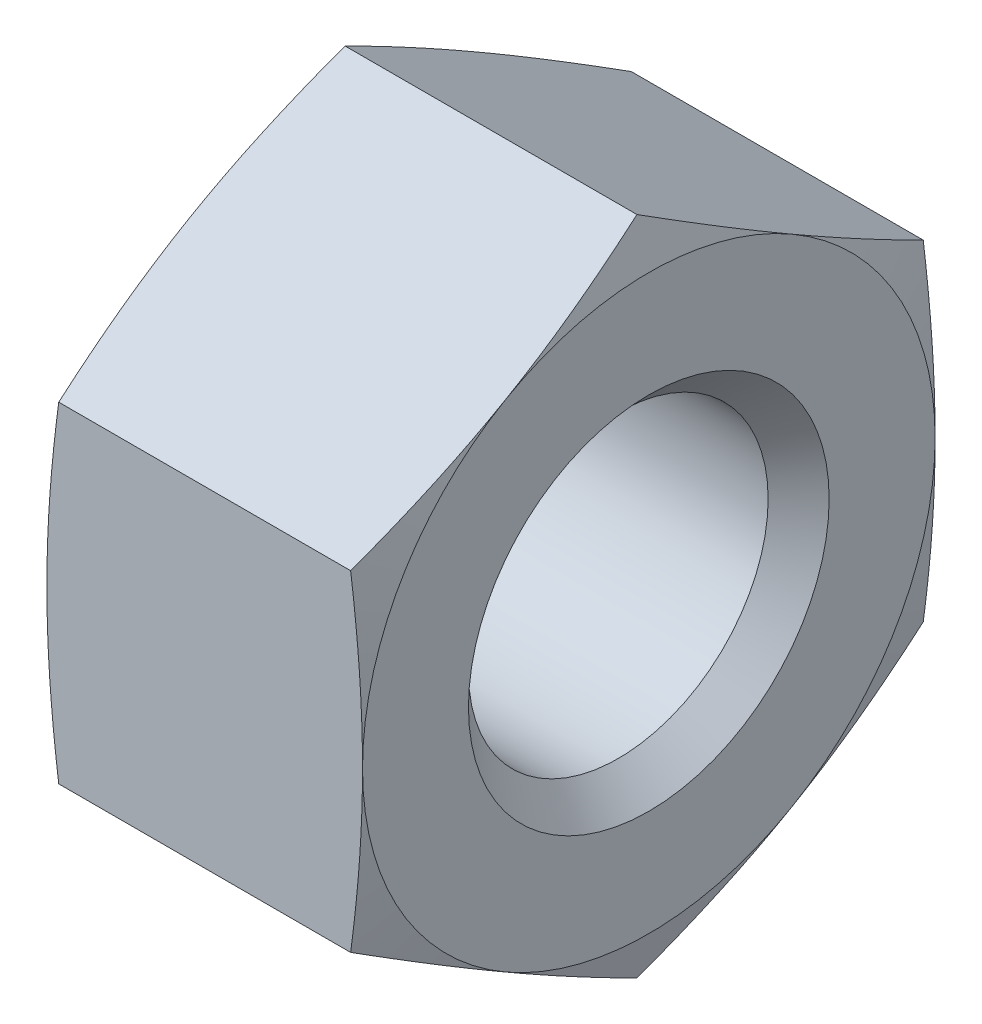
ISO-10303-21;
HEADER;
FILE_DESCRIPTION(('STEP AP214'),'2;1');
FILE_NAME('part.step','',(''),(''),'','','');
FILE_SCHEMA(('AUTOMOTIVE_DESIGN { 1 0 10303 214 1 1 1 1 }'));
ENDSEC;
DATA;
#1=APPLICATION_CONTEXT('core data for automotive mechanical design processes');
#2=APPLICATION_PROTOCOL_DEFINITION('international standard','automotive_design',2000,#1);
#3=PRODUCT_CONTEXT('',#1,'mechanical');
#4=PRODUCT('Part','Part','',(#3));
#5=PRODUCT_RELATED_PRODUCT_CATEGORY('part','',(#4));
#6=PRODUCT_DEFINITION_FORMATION('','',#4);
#7=PRODUCT_DEFINITION_CONTEXT('part definition',#1,'design');
#8=PRODUCT_DEFINITION('design','',#6,#7);
#9=PRODUCT_DEFINITION_SHAPE('','',#8);
#10=(LENGTH_UNIT() NAMED_UNIT(*) SI_UNIT(.MILLI.,.METRE.));
#11=(NAMED_UNIT(*) PLANE_ANGLE_UNIT() SI_UNIT($,.RADIAN.));
#12=(NAMED_UNIT(*) SI_UNIT($,.STERADIAN.) SOLID_ANGLE_UNIT());
#13=UNCERTAINTY_MEASURE_WITH_UNIT(LENGTH_MEASURE(1.E-05),#10,'distance_accuracy_value','');
#14=(GEOMETRIC_REPRESENTATION_CONTEXT(3) GLOBAL_UNCERTAINTY_ASSIGNED_CONTEXT((#13)) GLOBAL_UNIT_ASSIGNED_CONTEXT((#10,
#11,#12)) REPRESENTATION_CONTEXT('',''));
#15=CARTESIAN_POINT('',(0.,0.,0.));
#16=DIRECTION('',(0.,0.,1.));
#17=DIRECTION('',(1.,0.,0.));
#18=AXIS2_PLACEMENT_3D('',#15,#16,#17);
#19=CARTESIAN_POINT('',(-2.84459627531347,0.,0.));
#20=DIRECTION('',(1.,0.,0.));
#21=DIRECTION('',(0.,0.,-1.));
#22=AXIS2_PLACEMENT_3D('',#19,#20,#21);
#23=CONICAL_SURFACE('',#22,8.796,1.30899693899575);
#24=CARTESIAN_POINT('',(-2.09023737338536,-9.72110699457398,-6.35));
#25=CARTESIAN_POINT('',(-2.1549037561096,-9.43276513546185,-6.35));
#26=CARTESIAN_POINT('',(-2.21878305862571,-9.14424355510451,-6.35));
#27=CARTESIAN_POINT('',(-2.34454261816951,-8.56675263793695,-6.35));
#28=CARTESIAN_POINT('',(-2.40642278955093,-8.27778328249757,-6.35));
#29=CARTESIAN_POINT('',(-2.52781238843474,-7.69905286157475,-6.35));
#30=CARTESIAN_POINT('',(-2.58731946023013,-7.4092913002224,-6.35));
#31=CARTESIAN_POINT('',(-2.70332418135105,-6.82916671590729,-6.35));
#32=CARTESIAN_POINT('',(-2.75982185584135,-6.53880369799504,-6.35));
#33=CARTESIAN_POINT('',(-2.86865569167639,-5.95968440644315,-6.35));
#34=CARTESIAN_POINT('',(-2.92102136030525,-5.67093370536691,-6.35));
#35=CARTESIAN_POINT('',(-3.02120582018589,-5.09264594604098,-6.35));
#36=CARTESIAN_POINT('',(-3.06902471088682,-4.803108905133,-6.35));
#37=CARTESIAN_POINT('',(-3.15904374178742,-4.22318951807193,-6.35));
#38=CARTESIAN_POINT('',(-3.20124453355,-3.93280727394042,-6.35));
#39=CARTESIAN_POINT('',(-3.27878791405174,-3.35111799883056,-6.35));
#40=CARTESIAN_POINT('',(-3.31413049539845,-3.05981096685573,-6.35));
#41=CARTESIAN_POINT('',(-3.37696166244611,-2.47297598177912,-6.35));
#42=CARTESIAN_POINT('',(-3.40435604067154,-2.17743779049143,-6.35));
#43=CARTESIAN_POINT('',(-3.44940399072162,-1.58561352026764,-6.35));
#44=CARTESIAN_POINT('',(-3.46705778598243,-1.28932745864335,-6.35));
#45=CARTESIAN_POINT('',(-3.49159519776527,-0.696437944721525,-6.35));
#46=CARTESIAN_POINT('',(-3.49848379653031,-0.399834702859321,-6.35));
#47=CARTESIAN_POINT('',(-3.50106676899069,0.193421171137234,-6.35));
#48=CARTESIAN_POINT('',(-3.49676115632201,0.490073803210981,-6.35));
#49=CARTESIAN_POINT('',(-3.47719759959428,1.08409357581064,-6.35));
#50=CARTESIAN_POINT('',(-3.46189976285994,1.38145937558702,-6.35));
#51=CARTESIAN_POINT('',(-3.42122702141115,1.97549465697941,-6.35));
#52=CARTESIAN_POINT('',(-3.39585189198759,2.27216412291979,-6.35));
#53=CARTESIAN_POINT('',(-3.33631197546625,2.86480376235676,-6.35));
#54=CARTESIAN_POINT('',(-3.30214139681711,3.16077334491286,-6.35));
#55=CARTESIAN_POINT('',(-3.22643939044056,3.75175909465237,-6.35));
#56=CARTESIAN_POINT('',(-3.18490793986793,4.04677525887385,-6.35));
#57=CARTESIAN_POINT('',(-3.09847421039566,4.61833018620653,-6.35));
#58=CARTESIAN_POINT('',(-3.05392039727368,4.89492218148848,-6.35));
#59=CARTESIAN_POINT('',(-2.9604467595756,5.44737107521559,-6.35));
#60=CARTESIAN_POINT('',(-2.91152681237394,5.7232279527903,-6.35));
#61=CARTESIAN_POINT('',(-2.81012544492832,6.27430948723032,-6.35));
#62=CARTESIAN_POINT('',(-2.75764369599703,6.54953408331846,-6.35));
#63=CARTESIAN_POINT('',(-2.64977365313874,7.09941449898813,-6.35));
#64=CARTESIAN_POINT('',(-2.59438532089869,7.37407031102263,-6.35));
#65=CARTESIAN_POINT('',(-2.42465487764359,8.19743504032232,-6.35));
#66=CARTESIAN_POINT('',(-2.30677143923484,8.74541314560649,-6.35));
#67=CARTESIAN_POINT('',(-2.06462280067042,9.83990802772899,-6.35));
#68=CARTESIAN_POINT('',(-1.94035798444406,10.386424890405,-6.35));
#69=CARTESIAN_POINT('',(-1.68859215771958,11.4730215202682,-6.35));
#70=CARTESIAN_POINT('',(-1.56113525433586,12.0131115353762,-6.35));
#71=CARTESIAN_POINT('',(-1.30304273753613,13.0925398580688,-6.35));
#72=CARTESIAN_POINT('',(-1.17240706469589,13.631878151401,-6.35));
#73=CARTESIAN_POINT('',(-0.908956447628143,14.709301824136,-6.35));
#74=CARTESIAN_POINT('',(-0.776144452661951,15.2473879261256,-6.35));
#75=CARTESIAN_POINT('',(-0.508718230498277,16.323093298377,-6.35));
#76=CARTESIAN_POINT('',(-0.374104063730616,16.8607125836514,-6.35));
#77=CARTESIAN_POINT('',(-0.238852845977939,17.3981696004014,-6.35));
#78=B_SPLINE_CURVE_WITH_KNOTS('',3,(#24,#25,#26,#27,#28,#29,#30,#31,#32,#33,#34,#35,#36,#37,#38,
#39,#40,#41,#42,#43,#44,#45,#46,#47,#48,#49,#50,#51,#52,#53,#54,#55,#56,#57,#58,#59,#60,#61,#62,
#63,#64,#65,#66,#67,#68,#69,#70,#71,#72,#73,#74,#75,#76,#77),.UNSPECIFIED.,.F.,.F.,(4,2,2,2,2,2,
2,2,2,2,2,2,2,2,2,2,2,2,2,2,2,2,2,2,2,2,4),(0.,0.886516364540379,1.77307065875669,
2.66048414977435,3.54789021902079,4.42824302833179,5.30857657774151,6.18880794075046,
7.06904025255279,7.95931522242984,8.8495697697211,9.73941217595612,10.6292534982501,
11.5223406250963,12.4154476676166,13.3091443067143,14.2028437195406,15.043274560757,
15.8837290134218,16.7242611299637,17.5648043287389,19.2462817331826,20.9276580914477,
22.5924214234236,24.2572159005884,25.9199154034336,27.5825592921492),.UNSPECIFIED.);
#79=CARTESIAN_POINT('',(-3.23678053452113,-3.66617420935412,-6.35));
#80=VERTEX_POINT('',#79);
#81=CARTESIAN_POINT('',(-3.5,0.,-6.35));
#82=VERTEX_POINT('',#81);
#83=EDGE_CURVE('E339',#80,#82,#78,.T.);
#84=ORIENTED_EDGE('',*,*,#83,.F.);
#85=CARTESIAN_POINT('',(-3.2367495936826,-7.33246388876208,0.000200000000000038));
#86=CARTESIAN_POINT('',(-3.27756398218028,-7.1802073160986,-0.263516119639452));
#87=CARTESIAN_POINT('',(-3.31461672577556,-7.02767468308763,-0.527710389826713));
#88=CARTESIAN_POINT('',(-3.37971493881726,-6.72207073121692,-1.05703196146061));
#89=CARTESIAN_POINT('',(-3.40775674961042,-6.56899921899596,-1.32215959781872));
#90=CARTESIAN_POINT('',(-3.4531960206689,-6.26324559107865,-1.85174041597001));
#91=CARTESIAN_POINT('',(-3.47064766970713,-6.11056554293047,-2.11619001666473));
#92=CARTESIAN_POINT('',(-3.49404854662558,-5.80501073893052,-2.64542646168939));
#93=CARTESIAN_POINT('',(-3.5,-5.65213602648085,-2.9102132308447));
#94=CARTESIAN_POINT('',(-3.5,-5.34638660158152,-3.4397867691553));
#95=CARTESIAN_POINT('',(-3.49404854662558,-5.19351188913185,-3.70457353831061));
#96=CARTESIAN_POINT('',(-3.47064766970713,-4.8879570851319,-4.23380998333527));
#97=CARTESIAN_POINT('',(-3.4531960206689,-4.73527703698372,-4.49825958402999));
#98=CARTESIAN_POINT('',(-3.40775674961042,-4.42952340906641,-5.02784040218128));
#99=CARTESIAN_POINT('',(-3.37971493881726,-4.27645189684545,-5.29296803853939));
#100=CARTESIAN_POINT('',(-3.31461672577556,-3.97084794497474,-5.82228961017329));
#101=CARTESIAN_POINT('',(-3.27756398218028,-3.81831531196377,-6.08648388036055));
#102=CARTESIAN_POINT('',(-3.2367495936826,-3.66605873930029,-6.3502));
#103=B_SPLINE_CURVE_WITH_KNOTS('',3,(#85,#86,#87,#88,#89,#90,#91,#92,#93,#94,#95,#96,#97,#98,
#99,#100,#101,#102),.UNSPECIFIED.,.F.,.F.,(4,2,2,2,2,2,2,2,4),(0.,0.921756832598808,
1.84388744891418,2.76125893137181,3.67845286820181,4.5956468050318,5.51301828748943,
6.43514890380481,7.35690573640361),.UNSPECIFIED.);
#104=CARTESIAN_POINT('',(-3.5,-5.49926131403119,-3.175));
#105=VERTEX_POINT('',#104);
#106=EDGE_CURVE('E185',#105,#80,#103,.T.);
#107=ORIENTED_EDGE('',*,*,#106,.F.);
#108=CARTESIAN_POINT('',(-3.5,0.,0.));
#109=DIRECTION('',(-1.,0.,0.));
#110=DIRECTION('',(0.,0.,1.));
#111=AXIS2_PLACEMENT_3D('',#108,#109,#110);
#112=CIRCLE('',#111,6.35);
#113=EDGE_CURVE('E330',#82,#105,#112,.T.);
#114=ORIENTED_EDGE('',*,*,#113,.F.);
#115=EDGE_LOOP('',(#84,#107,#114));
#116=FACE_BOUND('',#115,.T.);
#117=ADVANCED_FACE('F37',(#116),#23,.T.);
#118=CARTESIAN_POINT('',(-3.23678053452113,3.66617420935412,-6.35));
#119=VERTEX_POINT('',#118);
#120=EDGE_CURVE('E192',#82,#119,#78,.T.);
#121=ORIENTED_EDGE('',*,*,#120,.F.);
#122=CARTESIAN_POINT('',(-3.5,5.49926131403118,-3.175));
#123=VERTEX_POINT('',#122);
#124=EDGE_CURVE('E331',#123,#82,#112,.T.);
#125=ORIENTED_EDGE('',*,*,#124,.F.);
#126=CARTESIAN_POINT('',(-3.2367495936826,3.66605873930029,-6.3502));
#127=CARTESIAN_POINT('',(-3.27756398218028,3.81831531196377,-6.08648388036055));
#128=CARTESIAN_POINT('',(-3.31461672577556,3.97084794497474,-5.82228961017329));
#129=CARTESIAN_POINT('',(-3.37971493881726,4.27645189684545,-5.29296803853939));
#130=CARTESIAN_POINT('',(-3.40775674961042,4.42952340906641,-5.02784040218128));
#131=CARTESIAN_POINT('',(-3.4531960206689,4.73527703698372,-4.49825958402999));
#132=CARTESIAN_POINT('',(-3.47064766970713,4.8879570851319,-4.23380998333527));
#133=CARTESIAN_POINT('',(-3.49404854662558,5.19351188913185,-3.70457353831061));
#134=CARTESIAN_POINT('',(-3.5,5.34638660158152,-3.4397867691553));
#135=CARTESIAN_POINT('',(-3.5,5.65213602648085,-2.9102132308447));
#136=CARTESIAN_POINT('',(-3.49404854662558,5.80501073893052,-2.64542646168939));
#137=CARTESIAN_POINT('',(-3.47064766970713,6.11056554293047,-2.11619001666473));
#138=CARTESIAN_POINT('',(-3.4531960206689,6.26324559107865,-1.85174041597001));
#139=CARTESIAN_POINT('',(-3.40775674961042,6.56899921899596,-1.32215959781872));
#140=CARTESIAN_POINT('',(-3.37971493881726,6.72207073121693,-1.05703196146061));
#141=CARTESIAN_POINT('',(-3.31461672577556,7.02767468308763,-0.527710389826713));
#142=CARTESIAN_POINT('',(-3.27756398218028,7.1802073160986,-0.263516119639452));
#143=CARTESIAN_POINT('',(-3.2367495936826,7.33246388876208,0.000200000000000244));
#144=B_SPLINE_CURVE_WITH_KNOTS('',3,(#126,#127,#128,#129,#130,#131,#132,#133,#134,#135,#136,
#137,#138,#139,#140,#141,#142,#143),.UNSPECIFIED.,.F.,.F.,(4,2,2,2,2,2,2,2,4),(0.,
0.921756832598807,1.84388744891418,2.76125893137181,3.67845286820181,4.5956468050318,
5.51301828748943,6.4351489038048,7.35690573640361),.UNSPECIFIED.);
#145=EDGE_CURVE('E205',#119,#123,#144,.T.);
#146=ORIENTED_EDGE('',*,*,#145,.F.);
#147=EDGE_LOOP('',(#121,#125,#146));
#148=FACE_BOUND('',#147,.T.);
#149=ADVANCED_FACE('F168',(#148),#23,.T.);
#150=CARTESIAN_POINT('',(-3.23678053452113,7.33234841870825,0.));
#151=VERTEX_POINT('',#150);
#152=EDGE_CURVE('E199',#123,#151,#144,.T.);
#153=ORIENTED_EDGE('',*,*,#152,.F.);
#154=CARTESIAN_POINT('',(-3.5,5.49926131403119,3.175));
#155=VERTEX_POINT('',#154);
#156=EDGE_CURVE('E45',#155,#123,#112,.T.);
#157=ORIENTED_EDGE('',*,*,#156,.F.);
#158=CARTESIAN_POINT('',(-3.2367495936826,7.33246388876208,-0.000200000000000038));
#159=CARTESIAN_POINT('',(-3.27756398218028,7.1802073160986,0.263516119639452));
#160=CARTESIAN_POINT('',(-3.31461672577556,7.02767468308763,0.527710389826713));
#161=CARTESIAN_POINT('',(-3.37971493881726,6.72207073121692,1.05703196146061));
#162=CARTESIAN_POINT('',(-3.40775674961042,6.56899921899596,1.32215959781872));
#163=CARTESIAN_POINT('',(-3.4531960206689,6.26324559107865,1.85174041597001));
#164=CARTESIAN_POINT('',(-3.47064766970713,6.11056554293047,2.11619001666473));
#165=CARTESIAN_POINT('',(-3.49404854662558,5.80501073893052,2.64542646168939));
#166=CARTESIAN_POINT('',(-3.5,5.65213602648085,2.9102132308447));
#167=CARTESIAN_POINT('',(-3.5,5.34638660158152,3.4397867691553));
#168=CARTESIAN_POINT('',(-3.49404854662558,5.19351188913185,3.70457353831061));
#169=CARTESIAN_POINT('',(-3.47064766970713,4.8879570851319,4.23380998333527));
#170=CARTESIAN_POINT('',(-3.4531960206689,4.73527703698372,4.49825958402999));
#171=CARTESIAN_POINT('',(-3.40775674961042,4.42952340906641,5.02784040218128));
#172=CARTESIAN_POINT('',(-3.37971493881726,4.27645189684545,5.29296803853939));
#173=CARTESIAN_POINT('',(-3.31461672577556,3.97084794497474,5.82228961017329));
#174=CARTESIAN_POINT('',(-3.27756398218028,3.81831531196377,6.08648388036055));
#175=CARTESIAN_POINT('',(-3.2367495936826,3.66605873930029,6.3502));
#176=B_SPLINE_CURVE_WITH_KNOTS('',3,(#158,#159,#160,#161,#162,#163,#164,#165,#166,#167,#168,
#169,#170,#171,#172,#173,#174,#175),.UNSPECIFIED.,.F.,.F.,(4,2,2,2,2,2,2,2,4),(0.,
0.921756832598808,1.84388744891418,2.76125893137181,3.67845286820181,4.5956468050318,
5.51301828748943,6.43514890380481,7.35690573640361),.UNSPECIFIED.);
#177=EDGE_CURVE('E134',#151,#155,#176,.T.);
#178=ORIENTED_EDGE('',*,*,#177,.F.);
#179=EDGE_LOOP('',(#153,#157,#178));
#180=FACE_BOUND('',#179,.T.);
#181=ADVANCED_FACE('F344',(#180),#23,.T.);
#182=CARTESIAN_POINT('',(-3.23678053452113,-7.33234841870825,0.));
#183=VERTEX_POINT('',#182);
#184=EDGE_CURVE('E232',#183,#105,#103,.T.);
#185=ORIENTED_EDGE('',*,*,#184,.F.);
#186=CARTESIAN_POINT('',(-3.2367495936826,-3.66605873930029,6.3502));
#187=CARTESIAN_POINT('',(-3.27756398218028,-3.81831531196377,6.08648388036055));
#188=CARTESIAN_POINT('',(-3.31461672577556,-3.97084794497474,5.82228961017329));
#189=CARTESIAN_POINT('',(-3.37971493881726,-4.27645189684545,5.29296803853939));
#190=CARTESIAN_POINT('',(-3.40775674961042,-4.42952340906641,5.02784040218128));
#191=CARTESIAN_POINT('',(-3.4531960206689,-4.73527703698372,4.49825958402999));
#192=CARTESIAN_POINT('',(-3.47064766970713,-4.8879570851319,4.23380998333527));
#193=CARTESIAN_POINT('',(-3.49404854662558,-5.19351188913185,3.70457353831061));
#194=CARTESIAN_POINT('',(-3.5,-5.34638660158152,3.4397867691553));
#195=CARTESIAN_POINT('',(-3.5,-5.65213602648085,2.9102132308447));
#196=CARTESIAN_POINT('',(-3.49404854662558,-5.80501073893052,2.64542646168939));
#197=CARTESIAN_POINT('',(-3.47064766970713,-6.11056554293047,2.11619001666473));
#198=CARTESIAN_POINT('',(-3.4531960206689,-6.26324559107865,1.85174041597001));
#199=CARTESIAN_POINT('',(-3.40775674961042,-6.56899921899596,1.32215959781872));
#200=CARTESIAN_POINT('',(-3.37971493881726,-6.72207073121693,1.05703196146061));
#201=CARTESIAN_POINT('',(-3.31461672577556,-7.02767468308763,0.527710389826713));
#202=CARTESIAN_POINT('',(-3.27756398218028,-7.1802073160986,0.263516119639452));
#203=CARTESIAN_POINT('',(-3.2367495936826,-7.33246388876208,-0.000200000000000244));
#204=B_SPLINE_CURVE_WITH_KNOTS('',3,(#186,#187,#188,#189,#190,#191,#192,#193,#194,#195,#196,
#197,#198,#199,#200,#201,#202,#203),.UNSPECIFIED.,.F.,.F.,(4,2,2,2,2,2,2,2,4),(0.,
0.921756832598807,1.84388744891418,2.76125893137181,3.67845286820181,4.5956468050318,
5.51301828748943,6.4351489038048,7.35690573640361),.UNSPECIFIED.);
#205=CARTESIAN_POINT('',(-3.5,-5.49926131403118,3.175));
#206=VERTEX_POINT('',#205);
#207=EDGE_CURVE('E178',#206,#183,#204,.T.);
#208=ORIENTED_EDGE('',*,*,#207,.F.);
#209=EDGE_CURVE('E328',#105,#206,#112,.T.);
#210=ORIENTED_EDGE('',*,*,#209,.F.);
#211=EDGE_LOOP('',(#185,#208,#210));
#212=FACE_BOUND('',#211,.T.);
#213=ADVANCED_FACE('F342',(#212),#23,.T.);
#214=CARTESIAN_POINT('',(-3.23678053452113,3.66617420935412,6.35));
#215=VERTEX_POINT('',#214);
#216=EDGE_CURVE('E128',#155,#215,#176,.T.);
#217=ORIENTED_EDGE('',*,*,#216,.F.);
#218=CARTESIAN_POINT('',(-3.5,0.,6.35));
#219=VERTEX_POINT('',#218);
#220=EDGE_CURVE('E11',#219,#155,#112,.T.);
#221=ORIENTED_EDGE('',*,*,#220,.F.);
#222=CARTESIAN_POINT('',(-2.09023737338536,-9.72110699457398,6.35));
#223=CARTESIAN_POINT('',(-2.1549037561096,-9.43276513546185,6.35));
#224=CARTESIAN_POINT('',(-2.21878305862571,-9.14424355510451,6.35));
#225=CARTESIAN_POINT('',(-2.34454261816951,-8.56675263793695,6.35));
#226=CARTESIAN_POINT('',(-2.40642278955093,-8.27778328249757,6.35));
#227=CARTESIAN_POINT('',(-2.52781238843474,-7.69905286157475,6.35));
#228=CARTESIAN_POINT('',(-2.58731946023013,-7.4092913002224,6.35));
#229=CARTESIAN_POINT('',(-2.70332418135105,-6.82916671590729,6.35));
#230=CARTESIAN_POINT('',(-2.75982185584135,-6.53880369799504,6.35));
#231=CARTESIAN_POINT('',(-2.86865569167639,-5.95968440644315,6.35));
#232=CARTESIAN_POINT('',(-2.92102136030525,-5.67093370536691,6.35));
#233=CARTESIAN_POINT('',(-3.02120582018589,-5.09264594604098,6.35));
#234=CARTESIAN_POINT('',(-3.06902471088682,-4.803108905133,6.35));
#235=CARTESIAN_POINT('',(-3.15904374178742,-4.22318951807193,6.35));
#236=CARTESIAN_POINT('',(-3.20124453355,-3.93280727394042,6.35));
#237=CARTESIAN_POINT('',(-3.27878791405174,-3.35111799883056,6.35));
#238=CARTESIAN_POINT('',(-3.31413049539845,-3.05981096685573,6.35));
#239=CARTESIAN_POINT('',(-3.37696166244611,-2.47297598177912,6.35));
#240=CARTESIAN_POINT('',(-3.40435604067154,-2.17743779049143,6.35));
#241=CARTESIAN_POINT('',(-3.44940399072162,-1.58561352026764,6.35));
#242=CARTESIAN_POINT('',(-3.46705778598243,-1.28932745864335,6.35));
#243=CARTESIAN_POINT('',(-3.49159519776527,-0.696437944721525,6.35));
#244=CARTESIAN_POINT('',(-3.49848379653031,-0.399834702859321,6.35));
#245=CARTESIAN_POINT('',(-3.50106676899069,0.193421171137234,6.35));
#246=CARTESIAN_POINT('',(-3.49676115632201,0.490073803210981,6.35));
#247=CARTESIAN_POINT('',(-3.47719759959428,1.08409357581064,6.35));
#248=CARTESIAN_POINT('',(-3.46189976285994,1.38145937558702,6.35));
#249=CARTESIAN_POINT('',(-3.42122702141115,1.97549465697941,6.35));
#250=CARTESIAN_POINT('',(-3.39585189198759,2.27216412291979,6.35));
#251=CARTESIAN_POINT('',(-3.33631197546625,2.86480376235676,6.35));
#252=CARTESIAN_POINT('',(-3.30214139681711,3.16077334491286,6.35));
#253=CARTESIAN_POINT('',(-3.22643939044056,3.75175909465237,6.35));
#254=CARTESIAN_POINT('',(-3.18490793986793,4.04677525887385,6.35));
#255=CARTESIAN_POINT('',(-3.09847421039566,4.61833018620653,6.35));
#256=CARTESIAN_POINT('',(-3.05392039727368,4.89492218148848,6.35));
#257=CARTESIAN_POINT('',(-2.9604467595756,5.44737107521559,6.35));
#258=CARTESIAN_POINT('',(-2.91152681237394,5.7232279527903,6.35));
#259=CARTESIAN_POINT('',(-2.81012544492832,6.27430948723032,6.35));
#260=CARTESIAN_POINT('',(-2.75764369599703,6.54953408331846,6.35));
#261=CARTESIAN_POINT('',(-2.64977365313874,7.09941449898813,6.35));
#262=CARTESIAN_POINT('',(-2.59438532089869,7.37407031102263,6.35));
#263=CARTESIAN_POINT('',(-2.42465487764359,8.19743504032232,6.35));
#264=CARTESIAN_POINT('',(-2.30677143923484,8.74541314560649,6.35));
#265=CARTESIAN_POINT('',(-2.06462280067042,9.83990802772899,6.35));
#266=CARTESIAN_POINT('',(-1.94035798444406,10.386424890405,6.35));
#267=CARTESIAN_POINT('',(-1.68859215771958,11.4730215202682,6.35));
#268=CARTESIAN_POINT('',(-1.56113525433586,12.0131115353762,6.35));
#269=CARTESIAN_POINT('',(-1.30304273753613,13.0925398580688,6.35));
#270=CARTESIAN_POINT('',(-1.17240706469589,13.631878151401,6.35));
#271=CARTESIAN_POINT('',(-0.908956447628143,14.709301824136,6.35));
#272=CARTESIAN_POINT('',(-0.776144452661951,15.2473879261256,6.35));
#273=CARTESIAN_POINT('',(-0.508718230498277,16.323093298377,6.35));
#274=CARTESIAN_POINT('',(-0.374104063730616,16.8607125836514,6.35));
#275=CARTESIAN_POINT('',(-0.238852845977939,17.3981696004014,6.35));
#276=B_SPLINE_CURVE_WITH_KNOTS('',3,(#222,#223,#224,#225,#226,#227,#228,#229,#230,#231,#232,
#233,#234,#235,#236,#237,#238,#239,#240,#241,#242,#243,#244,#245,#246,#247,#248,#249,#250,#251,
#252,#253,#254,#255,#256,#257,#258,#259,#260,#261,#262,#263,#264,#265,#266,#267,#268,#269,#270,
#271,#272,#273,#274,#275),.UNSPECIFIED.,.F.,.F.,(4,2,2,2,2,2,2,2,2,2,2,2,2,2,2,2,2,2,2,2,2,2,2,
2,2,2,4),(0.,0.886516364540379,1.77307065875669,2.66048414977435,3.54789021902079,
4.42824302833179,5.30857657774151,6.18880794075046,7.06904025255279,7.95931522242984,
8.8495697697211,9.73941217595612,10.6292534982501,11.5223406250963,12.4154476676166,
13.3091443067143,14.2028437195406,15.043274560757,15.8837290134218,16.7242611299637,
17.5648043287389,19.2462817331826,20.9276580914477,22.5924214234236,24.2572159005884,
25.9199154034336,27.5825592921492),.UNSPECIFIED.);
#277=EDGE_CURVE('E53',#215,#219,#276,.F.);
#278=ORIENTED_EDGE('',*,*,#277,.F.);
#279=EDGE_LOOP('',(#217,#221,#278));
#280=FACE_BOUND('',#279,.T.);
#281=ADVANCED_FACE('F144',(#280),#23,.T.);
#282=CARTESIAN_POINT('',(-3.23678053452113,-3.66617420935412,6.35));
#283=VERTEX_POINT('',#282);
#284=EDGE_CURVE('E244',#283,#206,#204,.T.);
#285=ORIENTED_EDGE('',*,*,#284,.F.);
#286=EDGE_CURVE('E146',#219,#283,#276,.F.);
#287=ORIENTED_EDGE('',*,*,#286,.F.);
#288=EDGE_CURVE('E46',#206,#219,#112,.T.);
#289=ORIENTED_EDGE('',*,*,#288,.F.);
#290=EDGE_LOOP('',(#285,#287,#289));
#291=FACE_BOUND('',#290,.T.);
#292=ADVANCED_FACE('F170',(#291),#23,.T.);
#293=CARTESIAN_POINT('',(3.5,0.,0.));
#294=DIRECTION('',(-1.,0.,0.));
#295=DIRECTION('',(0.,0.,1.));
#296=AXIS2_PLACEMENT_3D('',#293,#294,#295);
#297=CONICAL_SURFACE('',#296,6.35,1.30899693899575);
#298=CARTESIAN_POINT('',(3.2367495936826,3.66605873930029,6.3502));
#299=CARTESIAN_POINT('',(3.27756398218028,3.81831531196377,6.08648388036055));
#300=CARTESIAN_POINT('',(3.31461672577556,3.97084794497474,5.82228961017329));
#301=CARTESIAN_POINT('',(3.37971493881726,4.27645189684545,5.29296803853939));
#302=CARTESIAN_POINT('',(3.40775674961042,4.42952340906641,5.02784040218128));
#303=CARTESIAN_POINT('',(3.4531960206689,4.73527703698372,4.49825958402999));
#304=CARTESIAN_POINT('',(3.47064766970713,4.8879570851319,4.23380998333527));
#305=CARTESIAN_POINT('',(3.49404854662558,5.19351188913185,3.70457353831061));
#306=CARTESIAN_POINT('',(3.5,5.34638660158152,3.4397867691553));
#307=CARTESIAN_POINT('',(3.5,5.65213602648085,2.9102132308447));
#308=CARTESIAN_POINT('',(3.49404854662558,5.80501073893052,2.64542646168939));
#309=CARTESIAN_POINT('',(3.47064766970713,6.11056554293047,2.11619001666473));
#310=CARTESIAN_POINT('',(3.4531960206689,6.26324559107865,1.85174041597001));
#311=CARTESIAN_POINT('',(3.40775674961042,6.56899921899596,1.32215959781872));
#312=CARTESIAN_POINT('',(3.37971493881726,6.72207073121692,1.05703196146061));
#313=CARTESIAN_POINT('',(3.31461672577556,7.02767468308763,0.527710389826713));
#314=CARTESIAN_POINT('',(3.27756398218028,7.1802073160986,0.263516119639452));
#315=CARTESIAN_POINT('',(3.2367495936826,7.33246388876208,-0.000200000000000014));
#316=B_SPLINE_CURVE_WITH_KNOTS('',3,(#298,#299,#300,#301,#302,#303,#304,#305,#306,#307,#308,
#309,#310,#311,#312,#313,#314,#315),.UNSPECIFIED.,.F.,.F.,(4,2,2,2,2,2,2,2,4),(0.,
0.921756832598807,1.84388744891418,2.76125893137181,3.67845286820181,4.5956468050318,
5.51301828748943,6.43514890380481,7.35690573640361),.UNSPECIFIED.);
#317=CARTESIAN_POINT('',(3.23678053452113,3.66617420935412,6.35));
#318=VERTEX_POINT('',#317);
#319=CARTESIAN_POINT('',(3.5,5.49926131403118,3.175));
#320=VERTEX_POINT('',#319);
#321=EDGE_CURVE('E138',#318,#320,#316,.T.);
#322=ORIENTED_EDGE('',*,*,#321,.F.);
#323=CARTESIAN_POINT('',(2.09023737338536,-9.72110699457398,6.35));
#324=CARTESIAN_POINT('',(2.1549037561096,-9.43276513546184,6.35));
#325=CARTESIAN_POINT('',(2.21878305862571,-9.14424355510451,6.35));
#326=CARTESIAN_POINT('',(2.34454261816951,-8.56675263793694,6.35));
#327=CARTESIAN_POINT('',(2.40642278955093,-8.27778328249756,6.35));
#328=CARTESIAN_POINT('',(2.52781238843474,-7.69905286157475,6.35));
#329=CARTESIAN_POINT('',(2.58731946023013,-7.40929130022239,6.35));
#330=CARTESIAN_POINT('',(2.70332418135105,-6.82916671590728,6.35));
#331=CARTESIAN_POINT('',(2.75982185584135,-6.53880369799504,6.35));
#332=CARTESIAN_POINT('',(2.86865569167639,-5.95968440644315,6.35));
#333=CARTESIAN_POINT('',(2.92102136030525,-5.67093370536691,6.35));
#334=CARTESIAN_POINT('',(3.02120582018589,-5.09264594604098,6.35));
#335=CARTESIAN_POINT('',(3.06902471088682,-4.80310890513301,6.35));
#336=CARTESIAN_POINT('',(3.15904374178742,-4.22318951807193,6.35));
#337=CARTESIAN_POINT('',(3.20124453355,-3.93280727394042,6.35));
#338=CARTESIAN_POINT('',(3.27878791405174,-3.35111799883056,6.35));
#339=CARTESIAN_POINT('',(3.31413049539845,-3.05981096685573,6.35));
#340=CARTESIAN_POINT('',(3.37696166244611,-2.47297598177912,6.35));
#341=CARTESIAN_POINT('',(3.40435604067154,-2.17743779049143,6.35));
#342=CARTESIAN_POINT('',(3.44940399072162,-1.58561352026764,6.35));
#343=CARTESIAN_POINT('',(3.46705778598243,-1.28932745864335,6.35));
#344=CARTESIAN_POINT('',(3.49159519776527,-0.696437944721527,6.35));
#345=CARTESIAN_POINT('',(3.49848379653031,-0.399834702859323,6.35));
#346=CARTESIAN_POINT('',(3.50106676899069,0.193421171137233,6.35));
#347=CARTESIAN_POINT('',(3.49676115632201,0.490073803210981,6.35));
#348=CARTESIAN_POINT('',(3.47719759959428,1.08409357581064,6.35));
#349=CARTESIAN_POINT('',(3.46189976285994,1.38145937558702,6.35));
#350=CARTESIAN_POINT('',(3.42122702141115,1.97549465697941,6.35));
#351=CARTESIAN_POINT('',(3.39585189198759,2.27216412291979,6.35));
#352=CARTESIAN_POINT('',(3.33631197546625,2.86480376235676,6.35));
#353=CARTESIAN_POINT('',(3.30214139681711,3.16077334491286,6.35));
#354=CARTESIAN_POINT('',(3.22643939044056,3.75175909465237,6.35));
#355=CARTESIAN_POINT('',(3.18490793986793,4.04677525887385,6.35));
#356=CARTESIAN_POINT('',(3.09847421039566,4.61833018620653,6.35));
#357=CARTESIAN_POINT('',(3.05392039727368,4.89492218148848,6.35));
#358=CARTESIAN_POINT('',(2.9604467595756,5.44737107521559,6.35));
#359=CARTESIAN_POINT('',(2.91152681237394,5.7232279527903,6.35));
#360=CARTESIAN_POINT('',(2.81012544492832,6.27430948723032,6.35));
#361=CARTESIAN_POINT('',(2.75764369599704,6.54953408331846,6.35));
#362=CARTESIAN_POINT('',(2.64977365313874,7.09941449898813,6.35));
#363=CARTESIAN_POINT('',(2.59438532089869,7.37407031102263,6.35));
#364=CARTESIAN_POINT('',(2.42465487764359,8.19743504032231,6.35));
#365=CARTESIAN_POINT('',(2.30677143923485,8.74541314560649,6.35));
#366=CARTESIAN_POINT('',(2.06462280067042,9.83990802772899,6.35));
#367=CARTESIAN_POINT('',(1.94035798444406,10.386424890405,6.35));
#368=CARTESIAN_POINT('',(1.68859215771958,11.4730215202682,6.35));
#369=CARTESIAN_POINT('',(1.56113525433586,12.0131115353762,6.35));
#370=CARTESIAN_POINT('',(1.30304273753613,13.0925398580688,6.35));
#371=CARTESIAN_POINT('',(1.17240706469589,13.631878151401,6.35));
#372=CARTESIAN_POINT('',(0.90895644762814,14.709301824136,6.35));
#373=CARTESIAN_POINT('',(0.776144452661947,15.2473879261256,6.35));
#374=CARTESIAN_POINT('',(0.508718230498275,16.323093298377,6.35));
#375=CARTESIAN_POINT('',(0.374104063730615,16.8607125836514,6.35));
#376=CARTESIAN_POINT('',(0.238852845977939,17.3981696004014,6.35));
#377=B_SPLINE_CURVE_WITH_KNOTS('',3,(#323,#324,#325,#326,#327,#328,#329,#330,#331,#332,#333,
#334,#335,#336,#337,#338,#339,#340,#341,#342,#343,#344,#345,#346,#347,#348,#349,#350,#351,#352,
#353,#354,#355,#356,#357,#358,#359,#360,#361,#362,#363,#364,#365,#366,#367,#368,#369,#370,#371,
#372,#373,#374,#375,#376),.UNSPECIFIED.,.F.,.F.,(4,2,2,2,2,2,2,2,2,2,2,2,2,2,2,2,2,2,2,2,2,2,2,
2,2,2,4),(0.,0.886516364540377,1.77307065875669,2.66048414977435,3.54789021902078,
4.42824302833179,5.30857657774151,6.18880794075046,7.06904025255278,7.95931522242983,
8.84956976972109,9.73941217595611,10.6292534982501,11.5223406250963,12.4154476676166,
13.3091443067143,14.2028437195406,15.043274560757,15.8837290134218,16.7242611299637,
17.5648043287389,19.2462817331826,20.9276580914477,22.5924214234236,24.2572159005884,
25.9199154034336,27.5825592921492),.UNSPECIFIED.);
#378=CARTESIAN_POINT('',(3.5,0.,6.35));
#379=VERTEX_POINT('',#378);
#380=EDGE_CURVE('E141',#379,#318,#377,.T.);
#381=ORIENTED_EDGE('',*,*,#380,.F.);
#382=CARTESIAN_POINT('',(3.5,0.,0.));
#383=DIRECTION('',(-1.,0.,0.));
#384=DIRECTION('',(0.,0.,1.));
#385=AXIS2_PLACEMENT_3D('',#382,#383,#384);
#386=CIRCLE('',#385,6.35);
#387=EDGE_CURVE('E273',#379,#320,#386,.T.);
#388=ORIENTED_EDGE('',*,*,#387,.T.);
#389=EDGE_LOOP('',(#322,#381,#388));
#390=FACE_BOUND('',#389,.T.);
#391=ADVANCED_FACE('F171',(#390),#297,.T.);
#392=CARTESIAN_POINT('',(3.23678053452113,7.33234841870825,0.));
#393=VERTEX_POINT('',#392);
#394=EDGE_CURVE('E211',#320,#393,#316,.T.);
#395=ORIENTED_EDGE('',*,*,#394,.F.);
#396=CARTESIAN_POINT('',(3.5,5.49926131403118,-3.175));
#397=VERTEX_POINT('',#396);
#398=EDGE_CURVE('E279',#320,#397,#386,.T.);
#399=ORIENTED_EDGE('',*,*,#398,.T.);
#400=CARTESIAN_POINT('',(3.2367495936826,7.33246388876208,0.0002));
#401=CARTESIAN_POINT('',(3.27756398218028,7.1802073160986,-0.263516119639453));
#402=CARTESIAN_POINT('',(3.31461672577556,7.02767468308763,-0.527710389826713));
#403=CARTESIAN_POINT('',(3.37971493881726,6.72207073121692,-1.05703196146061));
#404=CARTESIAN_POINT('',(3.40775674961042,6.56899921899596,-1.32215959781872));
#405=CARTESIAN_POINT('',(3.4531960206689,6.26324559107865,-1.85174041597001));
#406=CARTESIAN_POINT('',(3.47064766970713,6.11056554293047,-2.11619001666473));
#407=CARTESIAN_POINT('',(3.49404854662558,5.80501073893052,-2.64542646168939));
#408=CARTESIAN_POINT('',(3.5,5.65213602648085,-2.9102132308447));
#409=CARTESIAN_POINT('',(3.5,5.34638660158152,-3.4397867691553));
#410=CARTESIAN_POINT('',(3.49404854662558,5.19351188913185,-3.70457353831061));
#411=CARTESIAN_POINT('',(3.47064766970713,4.8879570851319,-4.23380998333527));
#412=CARTESIAN_POINT('',(3.4531960206689,4.73527703698372,-4.49825958402999));
#413=CARTESIAN_POINT('',(3.40775674961042,4.42952340906641,-5.02784040218128));
#414=CARTESIAN_POINT('',(3.37971493881726,4.27645189684544,-5.29296803853939));
#415=CARTESIAN_POINT('',(3.31461672577556,3.97084794497474,-5.82228961017329));
#416=CARTESIAN_POINT('',(3.27756398218028,3.81831531196377,-6.08648388036055));
#417=CARTESIAN_POINT('',(3.2367495936826,3.66605873930029,-6.3502));
#418=B_SPLINE_CURVE_WITH_KNOTS('',3,(#400,#401,#402,#403,#404,#405,#406,#407,#408,#409,#410,
#411,#412,#413,#414,#415,#416,#417),.UNSPECIFIED.,.F.,.F.,(4,2,2,2,2,2,2,2,4),(0.,
0.921756832598808,1.84388744891418,2.76125893137181,3.67845286820181,4.59564680503181,
5.51301828748943,6.43514890380481,7.35690573640361),.UNSPECIFIED.);
#419=EDGE_CURVE('E206',#393,#397,#418,.T.);
#420=ORIENTED_EDGE('',*,*,#419,.F.);
#421=EDGE_LOOP('',(#395,#399,#420));
#422=FACE_BOUND('',#421,.T.);
#423=ADVANCED_FACE('F369',(#422),#297,.T.);
#424=CARTESIAN_POINT('',(3.23678053452113,3.66617420935412,-6.35));
#425=VERTEX_POINT('',#424);
#426=EDGE_CURVE('E207',#397,#425,#418,.T.);
#427=ORIENTED_EDGE('',*,*,#426,.F.);
#428=CARTESIAN_POINT('',(3.5,0.,-6.35));
#429=VERTEX_POINT('',#428);
#430=EDGE_CURVE('E277',#397,#429,#386,.T.);
#431=ORIENTED_EDGE('',*,*,#430,.T.);
#432=CARTESIAN_POINT('',(2.09023737338536,-9.72110699457398,-6.35));
#433=CARTESIAN_POINT('',(2.1549037561096,-9.43276513546184,-6.35));
#434=CARTESIAN_POINT('',(2.21878305862571,-9.14424355510451,-6.35));
#435=CARTESIAN_POINT('',(2.34454261816951,-8.56675263793694,-6.35));
#436=CARTESIAN_POINT('',(2.40642278955093,-8.27778328249756,-6.35));
#437=CARTESIAN_POINT('',(2.52781238843474,-7.69905286157475,-6.35));
#438=CARTESIAN_POINT('',(2.58731946023013,-7.40929130022239,-6.35));
#439=CARTESIAN_POINT('',(2.70332418135105,-6.82916671590728,-6.35));
#440=CARTESIAN_POINT('',(2.75982185584135,-6.53880369799504,-6.35));
#441=CARTESIAN_POINT('',(2.86865569167639,-5.95968440644315,-6.35));
#442=CARTESIAN_POINT('',(2.92102136030525,-5.67093370536691,-6.35));
#443=CARTESIAN_POINT('',(3.02120582018589,-5.09264594604098,-6.35));
#444=CARTESIAN_POINT('',(3.06902471088682,-4.80310890513301,-6.35));
#445=CARTESIAN_POINT('',(3.15904374178742,-4.22318951807193,-6.35));
#446=CARTESIAN_POINT('',(3.20124453355,-3.93280727394042,-6.35));
#447=CARTESIAN_POINT('',(3.27878791405174,-3.35111799883056,-6.35));
#448=CARTESIAN_POINT('',(3.31413049539845,-3.05981096685573,-6.35));
#449=CARTESIAN_POINT('',(3.37696166244611,-2.47297598177912,-6.35));
#450=CARTESIAN_POINT('',(3.40435604067154,-2.17743779049143,-6.35));
#451=CARTESIAN_POINT('',(3.44940399072162,-1.58561352026764,-6.35));
#452=CARTESIAN_POINT('',(3.46705778598243,-1.28932745864335,-6.35));
#453=CARTESIAN_POINT('',(3.49159519776527,-0.696437944721527,-6.35));
#454=CARTESIAN_POINT('',(3.49848379653031,-0.399834702859323,-6.35));
#455=CARTESIAN_POINT('',(3.50106676899069,0.193421171137233,-6.35));
#456=CARTESIAN_POINT('',(3.49676115632201,0.490073803210981,-6.35));
#457=CARTESIAN_POINT('',(3.47719759959428,1.08409357581064,-6.35));
#458=CARTESIAN_POINT('',(3.46189976285994,1.38145937558702,-6.35));
#459=CARTESIAN_POINT('',(3.42122702141115,1.97549465697941,-6.35));
#460=CARTESIAN_POINT('',(3.39585189198759,2.27216412291979,-6.35));
#461=CARTESIAN_POINT('',(3.33631197546625,2.86480376235676,-6.35));
#462=CARTESIAN_POINT('',(3.30214139681711,3.16077334491286,-6.35));
#463=CARTESIAN_POINT('',(3.22643939044056,3.75175909465237,-6.35));
#464=CARTESIAN_POINT('',(3.18490793986793,4.04677525887385,-6.35));
#465=CARTESIAN_POINT('',(3.09847421039566,4.61833018620653,-6.35));
#466=CARTESIAN_POINT('',(3.05392039727368,4.89492218148848,-6.35));
#467=CARTESIAN_POINT('',(2.9604467595756,5.44737107521559,-6.35));
#468=CARTESIAN_POINT('',(2.91152681237394,5.7232279527903,-6.35));
#469=CARTESIAN_POINT('',(2.81012544492832,6.27430948723032,-6.35));
#470=CARTESIAN_POINT('',(2.75764369599704,6.54953408331846,-6.35));
#471=CARTESIAN_POINT('',(2.64977365313874,7.09941449898813,-6.35));
#472=CARTESIAN_POINT('',(2.59438532089869,7.37407031102263,-6.35));
#473=CARTESIAN_POINT('',(2.42465487764359,8.19743504032231,-6.35));
#474=CARTESIAN_POINT('',(2.30677143923485,8.74541314560649,-6.35));
#475=CARTESIAN_POINT('',(2.06462280067042,9.83990802772899,-6.35));
#476=CARTESIAN_POINT('',(1.94035798444406,10.386424890405,-6.35));
#477=CARTESIAN_POINT('',(1.68859215771958,11.4730215202682,-6.35));
#478=CARTESIAN_POINT('',(1.56113525433586,12.0131115353762,-6.35));
#479=CARTESIAN_POINT('',(1.30304273753613,13.0925398580688,-6.35));
#480=CARTESIAN_POINT('',(1.17240706469589,13.631878151401,-6.35));
#481=CARTESIAN_POINT('',(0.90895644762814,14.709301824136,-6.35));
#482=CARTESIAN_POINT('',(0.776144452661947,15.2473879261256,-6.35));
#483=CARTESIAN_POINT('',(0.508718230498275,16.323093298377,-6.35));
#484=CARTESIAN_POINT('',(0.374104063730615,16.8607125836514,-6.35));
#485=CARTESIAN_POINT('',(0.238852845977939,17.3981696004014,-6.35));
#486=B_SPLINE_CURVE_WITH_KNOTS('',3,(#432,#433,#434,#435,#436,#437,#438,#439,#440,#441,#442,
#443,#444,#445,#446,#447,#448,#449,#450,#451,#452,#453,#454,#455,#456,#457,#458,#459,#460,#461,
#462,#463,#464,#465,#466,#467,#468,#469,#470,#471,#472,#473,#474,#475,#476,#477,#478,#479,#480,
#481,#482,#483,#484,#485),.UNSPECIFIED.,.F.,.F.,(4,2,2,2,2,2,2,2,2,2,2,2,2,2,2,2,2,2,2,2,2,2,2,
2,2,2,4),(0.,0.886516364540377,1.77307065875669,2.66048414977435,3.54789021902078,
4.42824302833179,5.30857657774151,6.18880794075046,7.06904025255278,7.95931522242983,
8.84956976972109,9.73941217595611,10.6292534982501,11.5223406250963,12.4154476676166,
13.3091443067143,14.2028437195406,15.043274560757,15.8837290134218,16.7242611299637,
17.5648043287389,19.2462817331826,20.9276580914477,22.5924214234236,24.2572159005884,
25.9199154034336,27.5825592921492),.UNSPECIFIED.);
#487=EDGE_CURVE('E231',#425,#429,#486,.F.);
#488=ORIENTED_EDGE('',*,*,#487,.F.);
#489=EDGE_LOOP('',(#427,#431,#488));
#490=FACE_BOUND('',#489,.T.);
#491=ADVANCED_FACE('F374',(#490),#297,.T.);
#492=CARTESIAN_POINT('',(3.23678053452113,-3.66617420935412,-6.35));
#493=VERTEX_POINT('',#492);
#494=EDGE_CURVE('E227',#429,#493,#486,.F.);
#495=ORIENTED_EDGE('',*,*,#494,.F.);
#496=CARTESIAN_POINT('',(3.5,-5.49926131403119,-3.175));
#497=VERTEX_POINT('',#496);
#498=EDGE_CURVE('E276',#429,#497,#386,.T.);
#499=ORIENTED_EDGE('',*,*,#498,.T.);
#500=CARTESIAN_POINT('',(3.2367495936826,-3.66605873930029,-6.3502));
#501=CARTESIAN_POINT('',(3.27756398218028,-3.81831531196377,-6.08648388036055));
#502=CARTESIAN_POINT('',(3.31461672577556,-3.97084794497474,-5.82228961017329));
#503=CARTESIAN_POINT('',(3.37971493881726,-4.27645189684545,-5.29296803853939));
#504=CARTESIAN_POINT('',(3.40775674961042,-4.42952340906641,-5.02784040218128));
#505=CARTESIAN_POINT('',(3.4531960206689,-4.73527703698372,-4.49825958402999));
#506=CARTESIAN_POINT('',(3.47064766970713,-4.8879570851319,-4.23380998333527));
#507=CARTESIAN_POINT('',(3.49404854662558,-5.19351188913185,-3.70457353831061));
#508=CARTESIAN_POINT('',(3.5,-5.34638660158152,-3.4397867691553));
#509=CARTESIAN_POINT('',(3.5,-5.65213602648085,-2.9102132308447));
#510=CARTESIAN_POINT('',(3.49404854662558,-5.80501073893052,-2.64542646168939));
#511=CARTESIAN_POINT('',(3.47064766970713,-6.11056554293047,-2.11619001666473));
#512=CARTESIAN_POINT('',(3.4531960206689,-6.26324559107865,-1.85174041597001));
#513=CARTESIAN_POINT('',(3.40775674961042,-6.56899921899596,-1.32215959781872));
#514=CARTESIAN_POINT('',(3.37971493881726,-6.72207073121692,-1.05703196146061));
#515=CARTESIAN_POINT('',(3.31461672577556,-7.02767468308763,-0.527710389826713));
#516=CARTESIAN_POINT('',(3.27756398218028,-7.1802073160986,-0.263516119639452));
#517=CARTESIAN_POINT('',(3.2367495936826,-7.33246388876208,0.000200000000000014));
#518=B_SPLINE_CURVE_WITH_KNOTS('',3,(#500,#501,#502,#503,#504,#505,#506,#507,#508,#509,#510,
#511,#512,#513,#514,#515,#516,#517),.UNSPECIFIED.,.F.,.F.,(4,2,2,2,2,2,2,2,4),(0.,
0.921756832598807,1.84388744891418,2.76125893137181,3.67845286820181,4.5956468050318,
5.51301828748943,6.43514890380481,7.35690573640361),.UNSPECIFIED.);
#519=EDGE_CURVE('E240',#493,#497,#518,.T.);
#520=ORIENTED_EDGE('',*,*,#519,.F.);
#521=EDGE_LOOP('',(#495,#499,#520));
#522=FACE_BOUND('',#521,.T.);
#523=ADVANCED_FACE('F383',(#522),#297,.T.);
#524=CARTESIAN_POINT('',(3.23678053452113,-7.33234841870825,0.));
#525=VERTEX_POINT('',#524);
#526=EDGE_CURVE('E241',#497,#525,#518,.T.);
#527=ORIENTED_EDGE('',*,*,#526,.F.);
#528=CARTESIAN_POINT('',(3.5,-5.49926131403119,3.175));
#529=VERTEX_POINT('',#528);
#530=EDGE_CURVE('E269',#497,#529,#386,.T.);
#531=ORIENTED_EDGE('',*,*,#530,.T.);
#532=CARTESIAN_POINT('',(3.2367495936826,-7.33246388876208,-0.0002));
#533=CARTESIAN_POINT('',(3.27756398218028,-7.1802073160986,0.263516119639453));
#534=CARTESIAN_POINT('',(3.31461672577556,-7.02767468308763,0.527710389826713));
#535=CARTESIAN_POINT('',(3.37971493881726,-6.72207073121692,1.05703196146061));
#536=CARTESIAN_POINT('',(3.40775674961042,-6.56899921899596,1.32215959781872));
#537=CARTESIAN_POINT('',(3.4531960206689,-6.26324559107865,1.85174041597001));
#538=CARTESIAN_POINT('',(3.47064766970713,-6.11056554293047,2.11619001666473));
#539=CARTESIAN_POINT('',(3.49404854662558,-5.80501073893052,2.64542646168939));
#540=CARTESIAN_POINT('',(3.5,-5.65213602648085,2.9102132308447));
#541=CARTESIAN_POINT('',(3.5,-5.34638660158152,3.4397867691553));
#542=CARTESIAN_POINT('',(3.49404854662558,-5.19351188913185,3.70457353831061));
#543=CARTESIAN_POINT('',(3.47064766970713,-4.8879570851319,4.23380998333527));
#544=CARTESIAN_POINT('',(3.4531960206689,-4.73527703698372,4.49825958402999));
#545=CARTESIAN_POINT('',(3.40775674961042,-4.42952340906641,5.02784040218128));
#546=CARTESIAN_POINT('',(3.37971493881726,-4.27645189684544,5.29296803853939));
#547=CARTESIAN_POINT('',(3.31461672577556,-3.97084794497474,5.82228961017329));
#548=CARTESIAN_POINT('',(3.27756398218028,-3.81831531196377,6.08648388036055));
#549=CARTESIAN_POINT('',(3.2367495936826,-3.66605873930029,6.3502));
#550=B_SPLINE_CURVE_WITH_KNOTS('',3,(#532,#533,#534,#535,#536,#537,#538,#539,#540,#541,#542,
#543,#544,#545,#546,#547,#548,#549),.UNSPECIFIED.,.F.,.F.,(4,2,2,2,2,2,2,2,4),(0.,
0.921756832598808,1.84388744891418,2.76125893137181,3.67845286820181,4.59564680503181,
5.51301828748943,6.43514890380481,7.35690573640361),.UNSPECIFIED.);
#551=EDGE_CURVE('E148',#525,#529,#550,.T.);
#552=ORIENTED_EDGE('',*,*,#551,.F.);
#553=EDGE_LOOP('',(#527,#531,#552));
#554=FACE_BOUND('',#553,.T.);
#555=ADVANCED_FACE('F275',(#554),#297,.T.);
#556=CARTESIAN_POINT('',(3.23678053452113,-3.66617420935412,6.35));
#557=VERTEX_POINT('',#556);
#558=EDGE_CURVE('E145',#529,#557,#550,.T.);
#559=ORIENTED_EDGE('',*,*,#558,.F.);
#560=EDGE_CURVE('E263',#529,#379,#386,.T.);
#561=ORIENTED_EDGE('',*,*,#560,.T.);
#562=EDGE_CURVE('E60',#557,#379,#377,.T.);
#563=ORIENTED_EDGE('',*,*,#562,.F.);
#564=EDGE_LOOP('',(#559,#561,#563));
#565=FACE_BOUND('',#564,.T.);
#566=ADVANCED_FACE('F262',(#565),#297,.T.);
#567=CARTESIAN_POINT('',(-3.5,0.,0.));
#568=DIRECTION('',(1.,0.,0.));
#569=DIRECTION('',(0.,0.,-1.));
#570=AXIS2_PLACEMENT_3D('',#567,#568,#569);
#571=PLANE('',#570);
#572=CARTESIAN_POINT('',(-3.5,0.,0.));
#573=DIRECTION('',(-1.,0.,0.));
#574=DIRECTION('',(0.,0.,1.));
#575=AXIS2_PLACEMENT_3D('',#572,#573,#574);
#576=CIRCLE('',#575,4.);
#577=CARTESIAN_POINT('',(-3.5,0.,4.));
#578=VERTEX_POINT('',#577);
#579=EDGE_CURVE('E274',#578,#578,#576,.T.);
#580=ORIENTED_EDGE('',*,*,#579,.F.);
#581=EDGE_LOOP('',(#580));
#582=FACE_BOUND('',#581,.T.);
#583=ORIENTED_EDGE('',*,*,#220,.T.);
#584=ORIENTED_EDGE('',*,*,#156,.T.);
#585=ORIENTED_EDGE('',*,*,#124,.T.);
#586=ORIENTED_EDGE('',*,*,#113,.T.);
#587=ORIENTED_EDGE('',*,*,#209,.T.);
#588=ORIENTED_EDGE('',*,*,#288,.T.);
#589=EDGE_LOOP('',(#583,#584,#585,#586,#587,#588));
#590=FACE_BOUND('',#589,.T.);
#591=ADVANCED_FACE('F39',(#582,#590),#571,.F.);
#592=CARTESIAN_POINT('',(3.5,6.35,0.));
#593=DIRECTION('',(-1.,0.,0.));
#594=DIRECTION('',(0.,0.,1.));
#595=AXIS2_PLACEMENT_3D('',#592,#593,#594);
#596=PLANE('',#595);
#597=CARTESIAN_POINT('',(3.5,0.,0.));
#598=DIRECTION('',(-1.,0.,0.));
#599=DIRECTION('',(0.,0.,1.));
#600=AXIS2_PLACEMENT_3D('',#597,#598,#599);
#601=CIRCLE('',#600,4.);
#602=CARTESIAN_POINT('',(3.5,0.,4.));
#603=VERTEX_POINT('',#602);
#604=EDGE_CURVE('E288',#603,#603,#601,.T.);
#605=ORIENTED_EDGE('',*,*,#604,.T.);
#606=EDGE_LOOP('',(#605));
#607=FACE_BOUND('',#606,.T.);
#608=ORIENTED_EDGE('',*,*,#387,.F.);
#609=ORIENTED_EDGE('',*,*,#560,.F.);
#610=ORIENTED_EDGE('',*,*,#530,.F.);
#611=ORIENTED_EDGE('',*,*,#498,.F.);
#612=ORIENTED_EDGE('',*,*,#430,.F.);
#613=ORIENTED_EDGE('',*,*,#398,.F.);
#614=EDGE_LOOP('',(#608,#609,#610,#611,#612,#613));
#615=FACE_BOUND('',#614,.T.);
#616=ADVANCED_FACE('F267',(#607,#615),#596,.F.);
#617=CARTESIAN_POINT('',(-2.8235,0.,0.));
#618=DIRECTION('',(-1.,0.,0.));
#619=DIRECTION('',(0.,0.,1.));
#620=AXIS2_PLACEMENT_3D('',#617,#618,#619);
#621=CONICAL_SURFACE('',#620,3.3235,0.785398163397448);
#622=ORIENTED_EDGE('',*,*,#579,.T.);
#623=EDGE_LOOP('',(#622));
#624=FACE_BOUND('',#623,.T.);
#625=CARTESIAN_POINT('',(-2.8235,0.,0.));
#626=DIRECTION('',(-1.,0.,0.));
#627=DIRECTION('',(0.,0.,1.));
#628=AXIS2_PLACEMENT_3D('',#625,#626,#627);
#629=CIRCLE('',#628,3.3235);
#630=CARTESIAN_POINT('',(-2.8235,0.,3.3235));
#631=VERTEX_POINT('',#630);
#632=EDGE_CURVE('E282',#631,#631,#629,.T.);
#633=ORIENTED_EDGE('',*,*,#632,.F.);
#634=EDGE_LOOP('',(#633));
#635=FACE_BOUND('',#634,.T.);
#636=ADVANCED_FACE('F304',(#624,#635),#621,.F.);
#637=CARTESIAN_POINT('',(3.5,0.,0.));
#638=DIRECTION('',(-1.,0.,0.));
#639=DIRECTION('',(0.,0.,1.));
#640=AXIS2_PLACEMENT_3D('',#637,#638,#639);
#641=CYLINDRICAL_SURFACE('',#640,3.3235);
#642=ORIENTED_EDGE('',*,*,#632,.T.);
#643=EDGE_LOOP('',(#642));
#644=FACE_BOUND('',#643,.T.);
#645=CARTESIAN_POINT('',(2.8235,0.,0.));
#646=DIRECTION('',(-1.,0.,0.));
#647=DIRECTION('',(0.,0.,1.));
#648=AXIS2_PLACEMENT_3D('',#645,#646,#647);
#649=CIRCLE('',#648,3.3235);
#650=CARTESIAN_POINT('',(2.8235,0.,3.3235));
#651=VERTEX_POINT('',#650);
#652=EDGE_CURVE('E285',#651,#651,#649,.T.);
#653=ORIENTED_EDGE('',*,*,#652,.F.);
#654=EDGE_LOOP('',(#653));
#655=FACE_BOUND('',#654,.T.);
#656=ADVANCED_FACE('F300',(#644,#655),#641,.F.);
#657=CARTESIAN_POINT('',(3.5,0.,0.));
#658=DIRECTION('',(1.,0.,0.));
#659=DIRECTION('',(0.,0.,-1.));
#660=AXIS2_PLACEMENT_3D('',#657,#658,#659);
#661=CONICAL_SURFACE('',#660,4.,0.785398163397448);
#662=ORIENTED_EDGE('',*,*,#652,.T.);
#663=EDGE_LOOP('',(#662));
#664=FACE_BOUND('',#663,.T.);
#665=ORIENTED_EDGE('',*,*,#604,.F.);
#666=EDGE_LOOP('',(#665));
#667=FACE_BOUND('',#666,.T.);
#668=ADVANCED_FACE('F296',(#664,#667),#661,.F.);
#669=CARTESIAN_POINT('',(-3.5,7.33234841870825,0.));
#670=DIRECTION('',(0.,0.866025403784439,0.5));
#671=DIRECTION('',(0.,-0.5,0.866025403784439));
#672=AXIS2_PLACEMENT_3D('',#669,#670,#671);
#673=PLANE('',#672);
#674=ORIENTED_EDGE('',*,*,#177,.T.);
#675=ORIENTED_EDGE('',*,*,#216,.T.);
#676=DIRECTION('',(1.,0.,0.));
#677=VECTOR('',#676,1.);
#678=CARTESIAN_POINT('',(-3.5,3.66617420935412,6.35));
#679=LINE('',#678,#677);
#680=EDGE_CURVE('E130',#215,#318,#679,.T.);
#681=ORIENTED_EDGE('',*,*,#680,.T.);
#682=ORIENTED_EDGE('',*,*,#321,.T.);
#683=ORIENTED_EDGE('',*,*,#394,.T.);
#684=DIRECTION('',(1.,0.,0.));
#685=VECTOR('',#684,1.);
#686=CARTESIAN_POINT('',(-3.5,7.33234841870825,0.));
#687=LINE('',#686,#685);
#688=EDGE_CURVE('E355',#151,#393,#687,.T.);
#689=ORIENTED_EDGE('',*,*,#688,.F.);
#690=EDGE_LOOP('',(#674,#675,#681,#682,#683,#689));
#691=FACE_BOUND('',#690,.T.);
#692=ADVANCED_FACE('F129',(#691),#673,.T.);
#693=CARTESIAN_POINT('',(-3.5,3.66617420935412,-6.35));
#694=DIRECTION('',(0.,0.866025403784439,-0.5));
#695=DIRECTION('',(0.,0.5,0.866025403784439));
#696=AXIS2_PLACEMENT_3D('',#693,#694,#695);
#697=PLANE('',#696);
#698=ORIENTED_EDGE('',*,*,#145,.T.);
#699=ORIENTED_EDGE('',*,*,#152,.T.);
#700=ORIENTED_EDGE('',*,*,#688,.T.);
#701=ORIENTED_EDGE('',*,*,#419,.T.);
#702=ORIENTED_EDGE('',*,*,#426,.T.);
#703=DIRECTION('',(1.,0.,0.));
#704=VECTOR('',#703,1.);
#705=CARTESIAN_POINT('',(-3.5,3.66617420935412,-6.35));
#706=LINE('',#705,#704);
#707=EDGE_CURVE('E358',#119,#425,#706,.T.);
#708=ORIENTED_EDGE('',*,*,#707,.F.);
#709=EDGE_LOOP('',(#698,#699,#700,#701,#702,#708));
#710=FACE_BOUND('',#709,.T.);
#711=ADVANCED_FACE('F215',(#710),#697,.T.);
#712=CARTESIAN_POINT('',(-3.5,-3.66617420935412,-6.35));
#713=DIRECTION('',(0.,0.,-1.));
#714=DIRECTION('',(-1.,0.,0.));
#715=AXIS2_PLACEMENT_3D('',#712,#713,#714);
#716=PLANE('',#715);
#717=ORIENTED_EDGE('',*,*,#83,.T.);
#718=ORIENTED_EDGE('',*,*,#120,.T.);
#719=ORIENTED_EDGE('',*,*,#707,.T.);
#720=ORIENTED_EDGE('',*,*,#487,.T.);
#721=ORIENTED_EDGE('',*,*,#494,.T.);
#722=DIRECTION('',(1.,0.,0.));
#723=VECTOR('',#722,1.);
#724=CARTESIAN_POINT('',(-3.5,-3.66617420935412,-6.35));
#725=LINE('',#724,#723);
#726=EDGE_CURVE('E360',#80,#493,#725,.T.);
#727=ORIENTED_EDGE('',*,*,#726,.F.);
#728=EDGE_LOOP('',(#717,#718,#719,#720,#721,#727));
#729=FACE_BOUND('',#728,.T.);
#730=ADVANCED_FACE('F218',(#729),#716,.T.);
#731=CARTESIAN_POINT('',(-3.5,-7.33234841870825,0.));
#732=DIRECTION('',(0.,-0.866025403784439,-0.5));
#733=DIRECTION('',(0.,0.5,-0.866025403784439));
#734=AXIS2_PLACEMENT_3D('',#731,#732,#733);
#735=PLANE('',#734);
#736=ORIENTED_EDGE('',*,*,#184,.T.);
#737=ORIENTED_EDGE('',*,*,#106,.T.);
#738=ORIENTED_EDGE('',*,*,#726,.T.);
#739=ORIENTED_EDGE('',*,*,#519,.T.);
#740=ORIENTED_EDGE('',*,*,#526,.T.);
#741=DIRECTION('',(1.,0.,0.));
#742=VECTOR('',#741,1.);
#743=CARTESIAN_POINT('',(-3.5,-7.33234841870825,0.));
#744=LINE('',#743,#742);
#745=EDGE_CURVE('E256',#183,#525,#744,.T.);
#746=ORIENTED_EDGE('',*,*,#745,.F.);
#747=EDGE_LOOP('',(#736,#737,#738,#739,#740,#746));
#748=FACE_BOUND('',#747,.T.);
#749=ADVANCED_FACE('F223',(#748),#735,.T.);
#750=CARTESIAN_POINT('',(-3.5,-3.66617420935412,6.35));
#751=DIRECTION('',(0.,-0.866025403784439,0.5));
#752=DIRECTION('',(0.,-0.5,-0.866025403784439));
#753=AXIS2_PLACEMENT_3D('',#750,#751,#752);
#754=PLANE('',#753);
#755=ORIENTED_EDGE('',*,*,#284,.T.);
#756=ORIENTED_EDGE('',*,*,#207,.T.);
#757=ORIENTED_EDGE('',*,*,#745,.T.);
#758=ORIENTED_EDGE('',*,*,#551,.T.);
#759=ORIENTED_EDGE('',*,*,#558,.T.);
#760=DIRECTION('',(1.,0.,0.));
#761=VECTOR('',#760,1.);
#762=CARTESIAN_POINT('',(-3.5,-3.66617420935412,6.35));
#763=LINE('',#762,#761);
#764=EDGE_CURVE('E142',#283,#557,#763,.T.);
#765=ORIENTED_EDGE('',*,*,#764,.F.);
#766=EDGE_LOOP('',(#755,#756,#757,#758,#759,#765));
#767=FACE_BOUND('',#766,.T.);
#768=ADVANCED_FACE('F255',(#767),#754,.T.);
#769=CARTESIAN_POINT('',(-3.5,3.66617420935412,6.35));
#770=DIRECTION('',(0.,0.,1.));
#771=DIRECTION('',(1.,0.,0.));
#772=AXIS2_PLACEMENT_3D('',#769,#770,#771);
#773=PLANE('',#772);
#774=ORIENTED_EDGE('',*,*,#277,.T.);
#775=ORIENTED_EDGE('',*,*,#286,.T.);
#776=ORIENTED_EDGE('',*,*,#764,.T.);
#777=ORIENTED_EDGE('',*,*,#562,.T.);
#778=ORIENTED_EDGE('',*,*,#380,.T.);
#779=ORIENTED_EDGE('',*,*,#680,.F.);
#780=EDGE_LOOP('',(#774,#775,#776,#777,#778,#779));
#781=FACE_BOUND('',#780,.T.);
#782=ADVANCED_FACE('F140',(#781),#773,.T.);
#783=CLOSED_SHELL('',(#117,#149,#181,#213,#281,#292,#391,#423,#491,#523,#555,#566,#591,#616,
#636,#656,#668,#692,#711,#730,#749,#768,#782));
#784=MANIFOLD_SOLID_BREP('B2',#783);
#785=ADVANCED_BREP_SHAPE_REPRESENTATION('',(#18,#784),#14);
#786=SHAPE_DEFINITION_REPRESENTATION(#9,#785);
ENDSEC;
END-ISO-10303-21;
